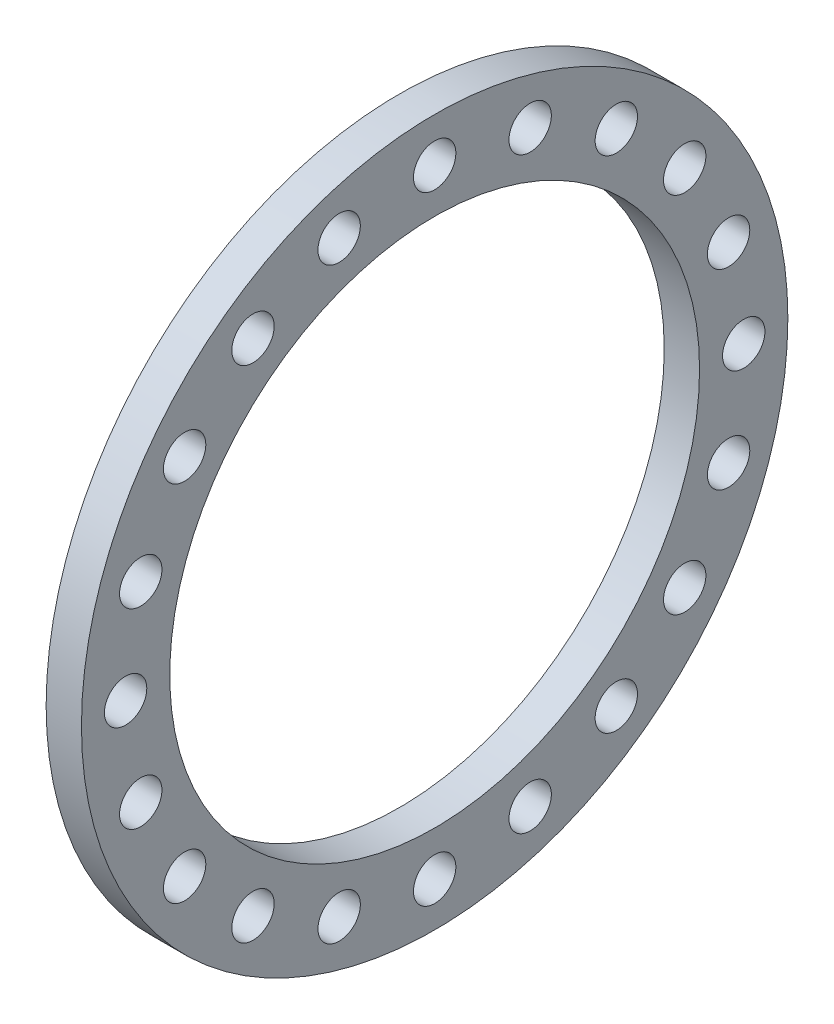
ISO-10303-21;
HEADER;
FILE_DESCRIPTION(('STEP AP214'),'2;1');
FILE_NAME('part.step','',(''),(''),'','','');
FILE_SCHEMA(('AUTOMOTIVE_DESIGN { 1 0 10303 214 1 1 1 1 }'));
ENDSEC;
DATA;
#1=APPLICATION_CONTEXT('core data for automotive mechanical design processes');
#2=APPLICATION_PROTOCOL_DEFINITION('international standard','automotive_design',2000,#1);
#3=PRODUCT_CONTEXT('',#1,'mechanical');
#4=PRODUCT('Part','Part','',(#3));
#5=PRODUCT_RELATED_PRODUCT_CATEGORY('part','',(#4));
#6=PRODUCT_DEFINITION_FORMATION('','',#4);
#7=PRODUCT_DEFINITION_CONTEXT('part definition',#1,'design');
#8=PRODUCT_DEFINITION('design','',#6,#7);
#9=PRODUCT_DEFINITION_SHAPE('','',#8);
#10=(LENGTH_UNIT() NAMED_UNIT(*) SI_UNIT(.MILLI.,.METRE.));
#11=(NAMED_UNIT(*) PLANE_ANGLE_UNIT() SI_UNIT($,.RADIAN.));
#12=(NAMED_UNIT(*) SI_UNIT($,.STERADIAN.) SOLID_ANGLE_UNIT());
#13=UNCERTAINTY_MEASURE_WITH_UNIT(LENGTH_MEASURE(1.E-05),#10,'distance_accuracy_value','');
#14=(GEOMETRIC_REPRESENTATION_CONTEXT(3) GLOBAL_UNCERTAINTY_ASSIGNED_CONTEXT((#13)) GLOBAL_UNIT_ASSIGNED_CONTEXT((#10,
#11,#12)) REPRESENTATION_CONTEXT('',''));
#15=CARTESIAN_POINT('',(0.,0.,0.));
#16=DIRECTION('',(0.,0.,1.));
#17=DIRECTION('',(1.,0.,0.));
#18=AXIS2_PLACEMENT_3D('',#15,#16,#17);
#19=CARTESIAN_POINT('',(5.,0.,0.));
#20=DIRECTION('',(1.,0.,0.));
#21=DIRECTION('',(0.,0.,-1.));
#22=AXIS2_PLACEMENT_3D('',#19,#20,#21);
#23=PLANE('',#22);
#24=CARTESIAN_POINT('',(5.,35.3944935039043,25.7156047877952));
#25=DIRECTION('',(1.,0.,0.));
#26=DIRECTION('',(0.,0.,-1.));
#27=AXIS2_PLACEMENT_3D('',#24,#25,#26);
#28=CIRCLE('',#27,2.99999999999999);
#29=CARTESIAN_POINT('',(5.,35.3944935039043,22.7156047877952));
#30=VERTEX_POINT('',#29);
#31=EDGE_CURVE('E163',#30,#30,#28,.T.);
#32=ORIENTED_EDGE('',*,*,#31,.F.);
#33=EDGE_LOOP('',(#32));
#34=FACE_BOUND('',#33,.T.);
#35=CARTESIAN_POINT('',(5.,13.5194935039044,41.6087225879128));
#36=DIRECTION('',(1.,0.,0.));
#37=DIRECTION('',(0.,0.,-1.));
#38=AXIS2_PLACEMENT_3D('',#35,#36,#37);
#39=CIRCLE('',#38,3.);
#40=CARTESIAN_POINT('',(5.,13.5194935039044,38.6087225879128));
#41=VERTEX_POINT('',#40);
#42=EDGE_CURVE('E151',#41,#41,#39,.T.);
#43=ORIENTED_EDGE('',*,*,#42,.F.);
#44=EDGE_LOOP('',(#43));
#45=FACE_BOUND('',#44,.T.);
#46=CARTESIAN_POINT('',(5.,-13.5194935039035,41.6087225879131));
#47=DIRECTION('',(1.,0.,0.));
#48=DIRECTION('',(0.,0.,-1.));
#49=AXIS2_PLACEMENT_3D('',#46,#47,#48);
#50=CIRCLE('',#49,3.);
#51=CARTESIAN_POINT('',(5.,-13.5194935039035,38.6087225879131));
#52=VERTEX_POINT('',#51);
#53=EDGE_CURVE('E139',#52,#52,#50,.T.);
#54=ORIENTED_EDGE('',*,*,#53,.F.);
#55=EDGE_LOOP('',(#54));
#56=FACE_BOUND('',#55,.T.);
#57=CARTESIAN_POINT('',(5.,-35.3944935039037,25.715604787796));
#58=DIRECTION('',(1.,0.,0.));
#59=DIRECTION('',(0.,0.,-1.));
#60=AXIS2_PLACEMENT_3D('',#57,#58,#59);
#61=CIRCLE('',#60,3.);
#62=CARTESIAN_POINT('',(5.,-35.3944935039037,22.715604787796));
#63=VERTEX_POINT('',#62);
#64=EDGE_CURVE('E127',#63,#63,#61,.T.);
#65=ORIENTED_EDGE('',*,*,#64,.F.);
#66=EDGE_LOOP('',(#65));
#67=FACE_BOUND('',#66,.T.);
#68=CARTESIAN_POINT('',(5.,-43.75,3.05504617148774E-13));
#69=DIRECTION('',(1.,0.,0.));
#70=DIRECTION('',(0.,0.,-1.));
#71=AXIS2_PLACEMENT_3D('',#68,#69,#70);
#72=CIRCLE('',#71,3.);
#73=CARTESIAN_POINT('',(5.,-43.75,-2.9999999999997));
#74=VERTEX_POINT('',#73);
#75=EDGE_CURVE('E115',#74,#74,#72,.T.);
#76=ORIENTED_EDGE('',*,*,#75,.F.);
#77=EDGE_LOOP('',(#76));
#78=FACE_BOUND('',#77,.T.);
#79=CARTESIAN_POINT('',(5.,-35.3944935039041,-25.7156047877955));
#80=DIRECTION('',(1.,0.,0.));
#81=DIRECTION('',(0.,0.,-1.));
#82=AXIS2_PLACEMENT_3D('',#79,#80,#81);
#83=CIRCLE('',#82,3.);
#84=CARTESIAN_POINT('',(5.,-35.3944935039041,-28.7156047877955));
#85=VERTEX_POINT('',#84);
#86=EDGE_CURVE('E103',#85,#85,#83,.T.);
#87=ORIENTED_EDGE('',*,*,#86,.F.);
#88=EDGE_LOOP('',(#87));
#89=FACE_BOUND('',#88,.T.);
#90=CARTESIAN_POINT('',(5.,-13.5194935039041,-41.6087225879129));
#91=DIRECTION('',(1.,0.,0.));
#92=DIRECTION('',(0.,0.,-1.));
#93=AXIS2_PLACEMENT_3D('',#90,#91,#92);
#94=CIRCLE('',#93,3.);
#95=CARTESIAN_POINT('',(5.,-13.5194935039041,-44.6087225879129));
#96=VERTEX_POINT('',#95);
#97=EDGE_CURVE('E91',#96,#96,#94,.T.);
#98=ORIENTED_EDGE('',*,*,#97,.F.);
#99=EDGE_LOOP('',(#98));
#100=FACE_BOUND('',#99,.T.);
#101=CARTESIAN_POINT('',(5.,13.5194935039038,-41.608722587913));
#102=DIRECTION('',(1.,0.,0.));
#103=DIRECTION('',(0.,0.,-1.));
#104=AXIS2_PLACEMENT_3D('',#101,#102,#103);
#105=CIRCLE('',#104,3.);
#106=CARTESIAN_POINT('',(5.,13.5194935039038,-44.608722587913));
#107=VERTEX_POINT('',#106);
#108=EDGE_CURVE('E79',#107,#107,#105,.T.);
#109=ORIENTED_EDGE('',*,*,#108,.F.);
#110=EDGE_LOOP('',(#109));
#111=FACE_BOUND('',#110,.T.);
#112=CARTESIAN_POINT('',(5.,35.3944935039039,-25.7156047877958));
#113=DIRECTION('',(1.,0.,0.));
#114=DIRECTION('',(0.,0.,-1.));
#115=AXIS2_PLACEMENT_3D('',#112,#113,#114);
#116=CIRCLE('',#115,3.);
#117=CARTESIAN_POINT('',(5.,35.3944935039039,-28.7156047877958));
#118=VERTEX_POINT('',#117);
#119=EDGE_CURVE('E67',#118,#118,#116,.T.);
#120=ORIENTED_EDGE('',*,*,#119,.F.);
#121=EDGE_LOOP('',(#120));
#122=FACE_BOUND('',#121,.T.);
#123=CARTESIAN_POINT('',(5.,43.75,0.));
#124=DIRECTION('',(1.,0.,0.));
#125=DIRECTION('',(0.,0.,-1.));
#126=AXIS2_PLACEMENT_3D('',#123,#124,#125);
#127=CIRCLE('',#126,3.);
#128=CARTESIAN_POINT('',(5.,43.75,-3.));
#129=VERTEX_POINT('',#128);
#130=EDGE_CURVE('E55',#129,#129,#127,.T.);
#131=ORIENTED_EDGE('',*,*,#130,.F.);
#132=EDGE_LOOP('',(#131));
#133=FACE_BOUND('',#132,.T.);
#134=CARTESIAN_POINT('',(5.,0.,0.));
#135=DIRECTION('',(1.,0.,0.));
#136=DIRECTION('',(0.,0.,-1.));
#137=AXIS2_PLACEMENT_3D('',#134,#135,#136);
#138=CIRCLE('',#137,50.);
#139=CARTESIAN_POINT('',(5.,0.,-50.));
#140=VERTEX_POINT('',#139);
#141=EDGE_CURVE('E10',#140,#140,#138,.T.);
#142=ORIENTED_EDGE('',*,*,#141,.T.);
#143=EDGE_LOOP('',(#142));
#144=FACE_BOUND('',#143,.T.);
#145=CARTESIAN_POINT('',(5.,0.,0.));
#146=DIRECTION('',(1.,0.,0.));
#147=DIRECTION('',(0.,0.,-1.));
#148=AXIS2_PLACEMENT_3D('',#145,#146,#147);
#149=CIRCLE('',#148,37.5);
#150=CARTESIAN_POINT('',(5.,0.,-37.5));
#151=VERTEX_POINT('',#150);
#152=EDGE_CURVE('E50',#151,#151,#149,.T.);
#153=ORIENTED_EDGE('',*,*,#152,.F.);
#154=EDGE_LOOP('',(#153));
#155=FACE_BOUND('',#154,.T.);
#156=CARTESIAN_POINT('',(5.,41.608722587913,-13.519493503904));
#157=DIRECTION('',(1.,0.,0.));
#158=DIRECTION('',(0.,0.,-1.));
#159=AXIS2_PLACEMENT_3D('',#156,#157,#158);
#160=CIRCLE('',#159,3.);
#161=CARTESIAN_POINT('',(5.,41.608722587913,-16.519493503904));
#162=VERTEX_POINT('',#161);
#163=EDGE_CURVE('E61',#162,#162,#160,.T.);
#164=ORIENTED_EDGE('',*,*,#163,.F.);
#165=EDGE_LOOP('',(#164));
#166=FACE_BOUND('',#165,.T.);
#167=CARTESIAN_POINT('',(5.,25.7156047877956,-35.394493503904));
#168=DIRECTION('',(1.,0.,0.));
#169=DIRECTION('',(0.,0.,-1.));
#170=AXIS2_PLACEMENT_3D('',#167,#168,#169);
#171=CIRCLE('',#170,3.);
#172=CARTESIAN_POINT('',(5.,25.7156047877956,-38.394493503904));
#173=VERTEX_POINT('',#172);
#174=EDGE_CURVE('E73',#173,#173,#171,.T.);
#175=ORIENTED_EDGE('',*,*,#174,.F.);
#176=EDGE_LOOP('',(#175));
#177=FACE_BOUND('',#176,.T.);
#178=CARTESIAN_POINT('',(5.,-1.52752308574387E-13,-43.75));
#179=DIRECTION('',(1.,0.,0.));
#180=DIRECTION('',(0.,0.,-1.));
#181=AXIS2_PLACEMENT_3D('',#178,#179,#180);
#182=CIRCLE('',#181,3.);
#183=CARTESIAN_POINT('',(5.,-1.52752308574387E-13,-46.75));
#184=VERTEX_POINT('',#183);
#185=EDGE_CURVE('E85',#184,#184,#182,.T.);
#186=ORIENTED_EDGE('',*,*,#185,.F.);
#187=EDGE_LOOP('',(#186));
#188=FACE_BOUND('',#187,.T.);
#189=CARTESIAN_POINT('',(5.,-25.7156047877959,-35.3944935039038));
#190=DIRECTION('',(1.,0.,0.));
#191=DIRECTION('',(0.,0.,-1.));
#192=AXIS2_PLACEMENT_3D('',#189,#190,#191);
#193=CIRCLE('',#192,3.);
#194=CARTESIAN_POINT('',(5.,-25.7156047877959,-38.3944935039038));
#195=VERTEX_POINT('',#194);
#196=EDGE_CURVE('E97',#195,#195,#193,.T.);
#197=ORIENTED_EDGE('',*,*,#196,.F.);
#198=EDGE_LOOP('',(#197));
#199=FACE_BOUND('',#198,.T.);
#200=CARTESIAN_POINT('',(5.,-41.6087225879131,-13.5194935039037));
#201=DIRECTION('',(1.,0.,0.));
#202=DIRECTION('',(0.,0.,-1.));
#203=AXIS2_PLACEMENT_3D('',#200,#201,#202);
#204=CIRCLE('',#203,3.);
#205=CARTESIAN_POINT('',(5.,-41.6087225879131,-16.5194935039037));
#206=VERTEX_POINT('',#205);
#207=EDGE_CURVE('E109',#206,#206,#204,.T.);
#208=ORIENTED_EDGE('',*,*,#207,.F.);
#209=EDGE_LOOP('',(#208));
#210=FACE_BOUND('',#209,.T.);
#211=CARTESIAN_POINT('',(5.,-41.6087225879129,13.5194935039043));
#212=DIRECTION('',(1.,0.,0.));
#213=DIRECTION('',(0.,0.,-1.));
#214=AXIS2_PLACEMENT_3D('',#211,#212,#213);
#215=CIRCLE('',#214,3.);
#216=CARTESIAN_POINT('',(5.,-41.6087225879129,10.5194935039043));
#217=VERTEX_POINT('',#216);
#218=EDGE_CURVE('E121',#217,#217,#215,.T.);
#219=ORIENTED_EDGE('',*,*,#218,.F.);
#220=EDGE_LOOP('',(#219));
#221=FACE_BOUND('',#220,.T.);
#222=CARTESIAN_POINT('',(5.,-25.7156047877954,35.3944935039042));
#223=DIRECTION('',(1.,0.,0.));
#224=DIRECTION('',(0.,0.,-1.));
#225=AXIS2_PLACEMENT_3D('',#222,#223,#224);
#226=CIRCLE('',#225,3.);
#227=CARTESIAN_POINT('',(5.,-25.7156047877954,32.3944935039042));
#228=VERTEX_POINT('',#227);
#229=EDGE_CURVE('E133',#228,#228,#226,.T.);
#230=ORIENTED_EDGE('',*,*,#229,.F.);
#231=EDGE_LOOP('',(#230));
#232=FACE_BOUND('',#231,.T.);
#233=CARTESIAN_POINT('',(5.,4.58256925723161E-13,43.75));
#234=DIRECTION('',(1.,0.,0.));
#235=DIRECTION('',(0.,0.,-1.));
#236=AXIS2_PLACEMENT_3D('',#233,#234,#235);
#237=CIRCLE('',#236,3.);
#238=CARTESIAN_POINT('',(5.,4.58256925723161E-13,40.75));
#239=VERTEX_POINT('',#238);
#240=EDGE_CURVE('E145',#239,#239,#237,.T.);
#241=ORIENTED_EDGE('',*,*,#240,.F.);
#242=EDGE_LOOP('',(#241));
#243=FACE_BOUND('',#242,.T.);
#244=CARTESIAN_POINT('',(5.,25.7156047877961,35.3944935039036));
#245=DIRECTION('',(1.,0.,0.));
#246=DIRECTION('',(0.,0.,-1.));
#247=AXIS2_PLACEMENT_3D('',#244,#245,#246);
#248=CIRCLE('',#247,3.);
#249=CARTESIAN_POINT('',(5.,25.7156047877961,32.3944935039036));
#250=VERTEX_POINT('',#249);
#251=EDGE_CURVE('E157',#250,#250,#248,.T.);
#252=ORIENTED_EDGE('',*,*,#251,.F.);
#253=EDGE_LOOP('',(#252));
#254=FACE_BOUND('',#253,.T.);
#255=CARTESIAN_POINT('',(5.,41.6087225879131,13.5194935039034));
#256=DIRECTION('',(1.,0.,0.));
#257=DIRECTION('',(0.,0.,-1.));
#258=AXIS2_PLACEMENT_3D('',#255,#256,#257);
#259=CIRCLE('',#258,3.);
#260=CARTESIAN_POINT('',(5.,41.6087225879131,10.5194935039034));
#261=VERTEX_POINT('',#260);
#262=EDGE_CURVE('E169',#261,#261,#259,.T.);
#263=ORIENTED_EDGE('',*,*,#262,.F.);
#264=EDGE_LOOP('',(#263));
#265=FACE_BOUND('',#264,.T.);
#266=ADVANCED_FACE('F39',(#34,#45,#56,#67,#78,#89,#100,#111,#122,#133,#144,#155,#166,#177,#188,
#199,#210,#221,#232,#243,#254,#265),#23,.T.);
#267=CARTESIAN_POINT('',(0.,0.,0.));
#268=DIRECTION('',(1.,0.,0.));
#269=DIRECTION('',(0.,0.,-1.));
#270=AXIS2_PLACEMENT_3D('',#267,#268,#269);
#271=PLANE('',#270);
#272=CARTESIAN_POINT('',(0.,0.,0.));
#273=DIRECTION('',(1.,0.,0.));
#274=DIRECTION('',(0.,0.,-1.));
#275=AXIS2_PLACEMENT_3D('',#272,#273,#274);
#276=CIRCLE('',#275,50.);
#277=CARTESIAN_POINT('',(0.,0.,-50.));
#278=VERTEX_POINT('',#277);
#279=EDGE_CURVE('E43',#278,#278,#276,.T.);
#280=ORIENTED_EDGE('',*,*,#279,.F.);
#281=EDGE_LOOP('',(#280));
#282=FACE_BOUND('',#281,.T.);
#283=CARTESIAN_POINT('',(0.,0.,0.));
#284=DIRECTION('',(1.,0.,0.));
#285=DIRECTION('',(0.,0.,-1.));
#286=AXIS2_PLACEMENT_3D('',#283,#284,#285);
#287=CIRCLE('',#286,37.5);
#288=CARTESIAN_POINT('',(0.,0.,-37.5));
#289=VERTEX_POINT('',#288);
#290=EDGE_CURVE('E52',#289,#289,#287,.T.);
#291=ORIENTED_EDGE('',*,*,#290,.T.);
#292=EDGE_LOOP('',(#291));
#293=FACE_BOUND('',#292,.T.);
#294=CARTESIAN_POINT('',(0.,43.75,0.));
#295=DIRECTION('',(1.,0.,0.));
#296=DIRECTION('',(0.,0.,-1.));
#297=AXIS2_PLACEMENT_3D('',#294,#295,#296);
#298=CIRCLE('',#297,3.);
#299=CARTESIAN_POINT('',(0.,43.75,-3.));
#300=VERTEX_POINT('',#299);
#301=EDGE_CURVE('E58',#300,#300,#298,.T.);
#302=ORIENTED_EDGE('',*,*,#301,.T.);
#303=EDGE_LOOP('',(#302));
#304=FACE_BOUND('',#303,.T.);
#305=CARTESIAN_POINT('',(0.,41.608722587913,-13.519493503904));
#306=DIRECTION('',(1.,0.,0.));
#307=DIRECTION('',(0.,0.,-1.));
#308=AXIS2_PLACEMENT_3D('',#305,#306,#307);
#309=CIRCLE('',#308,3.);
#310=CARTESIAN_POINT('',(0.,41.608722587913,-16.519493503904));
#311=VERTEX_POINT('',#310);
#312=EDGE_CURVE('E64',#311,#311,#309,.T.);
#313=ORIENTED_EDGE('',*,*,#312,.T.);
#314=EDGE_LOOP('',(#313));
#315=FACE_BOUND('',#314,.T.);
#316=CARTESIAN_POINT('',(0.,35.3944935039039,-25.7156047877958));
#317=DIRECTION('',(1.,0.,0.));
#318=DIRECTION('',(0.,0.,-1.));
#319=AXIS2_PLACEMENT_3D('',#316,#317,#318);
#320=CIRCLE('',#319,3.);
#321=CARTESIAN_POINT('',(0.,35.3944935039039,-28.7156047877958));
#322=VERTEX_POINT('',#321);
#323=EDGE_CURVE('E70',#322,#322,#320,.T.);
#324=ORIENTED_EDGE('',*,*,#323,.T.);
#325=EDGE_LOOP('',(#324));
#326=FACE_BOUND('',#325,.T.);
#327=CARTESIAN_POINT('',(0.,25.7156047877956,-35.394493503904));
#328=DIRECTION('',(1.,0.,0.));
#329=DIRECTION('',(0.,0.,-1.));
#330=AXIS2_PLACEMENT_3D('',#327,#328,#329);
#331=CIRCLE('',#330,3.);
#332=CARTESIAN_POINT('',(0.,25.7156047877956,-38.394493503904));
#333=VERTEX_POINT('',#332);
#334=EDGE_CURVE('E76',#333,#333,#331,.T.);
#335=ORIENTED_EDGE('',*,*,#334,.T.);
#336=EDGE_LOOP('',(#335));
#337=FACE_BOUND('',#336,.T.);
#338=CARTESIAN_POINT('',(0.,13.5194935039038,-41.608722587913));
#339=DIRECTION('',(1.,0.,0.));
#340=DIRECTION('',(0.,0.,-1.));
#341=AXIS2_PLACEMENT_3D('',#338,#339,#340);
#342=CIRCLE('',#341,3.);
#343=CARTESIAN_POINT('',(0.,13.5194935039038,-44.608722587913));
#344=VERTEX_POINT('',#343);
#345=EDGE_CURVE('E82',#344,#344,#342,.T.);
#346=ORIENTED_EDGE('',*,*,#345,.T.);
#347=EDGE_LOOP('',(#346));
#348=FACE_BOUND('',#347,.T.);
#349=CARTESIAN_POINT('',(0.,-1.52752308574387E-13,-43.75));
#350=DIRECTION('',(1.,0.,0.));
#351=DIRECTION('',(0.,0.,-1.));
#352=AXIS2_PLACEMENT_3D('',#349,#350,#351);
#353=CIRCLE('',#352,3.);
#354=CARTESIAN_POINT('',(0.,-1.52752308574387E-13,-46.75));
#355=VERTEX_POINT('',#354);
#356=EDGE_CURVE('E88',#355,#355,#353,.T.);
#357=ORIENTED_EDGE('',*,*,#356,.T.);
#358=EDGE_LOOP('',(#357));
#359=FACE_BOUND('',#358,.T.);
#360=CARTESIAN_POINT('',(0.,-13.5194935039041,-41.6087225879129));
#361=DIRECTION('',(1.,0.,0.));
#362=DIRECTION('',(0.,0.,-1.));
#363=AXIS2_PLACEMENT_3D('',#360,#361,#362);
#364=CIRCLE('',#363,3.);
#365=CARTESIAN_POINT('',(0.,-13.5194935039041,-44.6087225879129));
#366=VERTEX_POINT('',#365);
#367=EDGE_CURVE('E94',#366,#366,#364,.T.);
#368=ORIENTED_EDGE('',*,*,#367,.T.);
#369=EDGE_LOOP('',(#368));
#370=FACE_BOUND('',#369,.T.);
#371=CARTESIAN_POINT('',(0.,-25.7156047877959,-35.3944935039038));
#372=DIRECTION('',(1.,0.,0.));
#373=DIRECTION('',(0.,0.,-1.));
#374=AXIS2_PLACEMENT_3D('',#371,#372,#373);
#375=CIRCLE('',#374,3.);
#376=CARTESIAN_POINT('',(0.,-25.7156047877959,-38.3944935039038));
#377=VERTEX_POINT('',#376);
#378=EDGE_CURVE('E100',#377,#377,#375,.T.);
#379=ORIENTED_EDGE('',*,*,#378,.T.);
#380=EDGE_LOOP('',(#379));
#381=FACE_BOUND('',#380,.T.);
#382=CARTESIAN_POINT('',(0.,-35.3944935039041,-25.7156047877955));
#383=DIRECTION('',(1.,0.,0.));
#384=DIRECTION('',(0.,0.,-1.));
#385=AXIS2_PLACEMENT_3D('',#382,#383,#384);
#386=CIRCLE('',#385,3.);
#387=CARTESIAN_POINT('',(0.,-35.3944935039041,-28.7156047877955));
#388=VERTEX_POINT('',#387);
#389=EDGE_CURVE('E106',#388,#388,#386,.T.);
#390=ORIENTED_EDGE('',*,*,#389,.T.);
#391=EDGE_LOOP('',(#390));
#392=FACE_BOUND('',#391,.T.);
#393=CARTESIAN_POINT('',(0.,-41.6087225879131,-13.5194935039037));
#394=DIRECTION('',(1.,0.,0.));
#395=DIRECTION('',(0.,0.,-1.));
#396=AXIS2_PLACEMENT_3D('',#393,#394,#395);
#397=CIRCLE('',#396,3.);
#398=CARTESIAN_POINT('',(0.,-41.6087225879131,-16.5194935039037));
#399=VERTEX_POINT('',#398);
#400=EDGE_CURVE('E112',#399,#399,#397,.T.);
#401=ORIENTED_EDGE('',*,*,#400,.T.);
#402=EDGE_LOOP('',(#401));
#403=FACE_BOUND('',#402,.T.);
#404=CARTESIAN_POINT('',(0.,-43.75,3.05504617148774E-13));
#405=DIRECTION('',(1.,0.,0.));
#406=DIRECTION('',(0.,0.,-1.));
#407=AXIS2_PLACEMENT_3D('',#404,#405,#406);
#408=CIRCLE('',#407,3.);
#409=CARTESIAN_POINT('',(0.,-43.75,-2.9999999999997));
#410=VERTEX_POINT('',#409);
#411=EDGE_CURVE('E118',#410,#410,#408,.T.);
#412=ORIENTED_EDGE('',*,*,#411,.T.);
#413=EDGE_LOOP('',(#412));
#414=FACE_BOUND('',#413,.T.);
#415=CARTESIAN_POINT('',(0.,-41.6087225879129,13.5194935039043));
#416=DIRECTION('',(1.,0.,0.));
#417=DIRECTION('',(0.,0.,-1.));
#418=AXIS2_PLACEMENT_3D('',#415,#416,#417);
#419=CIRCLE('',#418,3.);
#420=CARTESIAN_POINT('',(0.,-41.6087225879129,10.5194935039043));
#421=VERTEX_POINT('',#420);
#422=EDGE_CURVE('E124',#421,#421,#419,.T.);
#423=ORIENTED_EDGE('',*,*,#422,.T.);
#424=EDGE_LOOP('',(#423));
#425=FACE_BOUND('',#424,.T.);
#426=CARTESIAN_POINT('',(0.,-35.3944935039037,25.715604787796));
#427=DIRECTION('',(1.,0.,0.));
#428=DIRECTION('',(0.,0.,-1.));
#429=AXIS2_PLACEMENT_3D('',#426,#427,#428);
#430=CIRCLE('',#429,3.);
#431=CARTESIAN_POINT('',(0.,-35.3944935039037,22.715604787796));
#432=VERTEX_POINT('',#431);
#433=EDGE_CURVE('E130',#432,#432,#430,.T.);
#434=ORIENTED_EDGE('',*,*,#433,.T.);
#435=EDGE_LOOP('',(#434));
#436=FACE_BOUND('',#435,.T.);
#437=CARTESIAN_POINT('',(0.,-25.7156047877954,35.3944935039042));
#438=DIRECTION('',(1.,0.,0.));
#439=DIRECTION('',(0.,0.,-1.));
#440=AXIS2_PLACEMENT_3D('',#437,#438,#439);
#441=CIRCLE('',#440,3.);
#442=CARTESIAN_POINT('',(0.,-25.7156047877954,32.3944935039042));
#443=VERTEX_POINT('',#442);
#444=EDGE_CURVE('E136',#443,#443,#441,.T.);
#445=ORIENTED_EDGE('',*,*,#444,.T.);
#446=EDGE_LOOP('',(#445));
#447=FACE_BOUND('',#446,.T.);
#448=CARTESIAN_POINT('',(0.,-13.5194935039035,41.6087225879131));
#449=DIRECTION('',(1.,0.,0.));
#450=DIRECTION('',(0.,0.,-1.));
#451=AXIS2_PLACEMENT_3D('',#448,#449,#450);
#452=CIRCLE('',#451,3.);
#453=CARTESIAN_POINT('',(0.,-13.5194935039035,38.6087225879131));
#454=VERTEX_POINT('',#453);
#455=EDGE_CURVE('E142',#454,#454,#452,.T.);
#456=ORIENTED_EDGE('',*,*,#455,.T.);
#457=EDGE_LOOP('',(#456));
#458=FACE_BOUND('',#457,.T.);
#459=CARTESIAN_POINT('',(0.,4.58256925723161E-13,43.75));
#460=DIRECTION('',(1.,0.,0.));
#461=DIRECTION('',(0.,0.,-1.));
#462=AXIS2_PLACEMENT_3D('',#459,#460,#461);
#463=CIRCLE('',#462,3.);
#464=CARTESIAN_POINT('',(0.,4.58256925723161E-13,40.75));
#465=VERTEX_POINT('',#464);
#466=EDGE_CURVE('E148',#465,#465,#463,.T.);
#467=ORIENTED_EDGE('',*,*,#466,.T.);
#468=EDGE_LOOP('',(#467));
#469=FACE_BOUND('',#468,.T.);
#470=CARTESIAN_POINT('',(0.,13.5194935039044,41.6087225879128));
#471=DIRECTION('',(1.,0.,0.));
#472=DIRECTION('',(0.,0.,-1.));
#473=AXIS2_PLACEMENT_3D('',#470,#471,#472);
#474=CIRCLE('',#473,3.);
#475=CARTESIAN_POINT('',(0.,13.5194935039044,38.6087225879128));
#476=VERTEX_POINT('',#475);
#477=EDGE_CURVE('E154',#476,#476,#474,.T.);
#478=ORIENTED_EDGE('',*,*,#477,.T.);
#479=EDGE_LOOP('',(#478));
#480=FACE_BOUND('',#479,.T.);
#481=CARTESIAN_POINT('',(0.,25.7156047877961,35.3944935039036));
#482=DIRECTION('',(1.,0.,0.));
#483=DIRECTION('',(0.,0.,-1.));
#484=AXIS2_PLACEMENT_3D('',#481,#482,#483);
#485=CIRCLE('',#484,3.);
#486=CARTESIAN_POINT('',(0.,25.7156047877961,32.3944935039036));
#487=VERTEX_POINT('',#486);
#488=EDGE_CURVE('E160',#487,#487,#485,.T.);
#489=ORIENTED_EDGE('',*,*,#488,.T.);
#490=EDGE_LOOP('',(#489));
#491=FACE_BOUND('',#490,.T.);
#492=CARTESIAN_POINT('',(0.,35.3944935039043,25.7156047877952));
#493=DIRECTION('',(1.,0.,0.));
#494=DIRECTION('',(0.,0.,-1.));
#495=AXIS2_PLACEMENT_3D('',#492,#493,#494);
#496=CIRCLE('',#495,2.99999999999999);
#497=CARTESIAN_POINT('',(0.,35.3944935039043,22.7156047877952));
#498=VERTEX_POINT('',#497);
#499=EDGE_CURVE('E166',#498,#498,#496,.T.);
#500=ORIENTED_EDGE('',*,*,#499,.T.);
#501=EDGE_LOOP('',(#500));
#502=FACE_BOUND('',#501,.T.);
#503=CARTESIAN_POINT('',(0.,41.6087225879131,13.5194935039034));
#504=DIRECTION('',(1.,0.,0.));
#505=DIRECTION('',(0.,0.,-1.));
#506=AXIS2_PLACEMENT_3D('',#503,#504,#505);
#507=CIRCLE('',#506,3.);
#508=CARTESIAN_POINT('',(0.,41.6087225879131,10.5194935039034));
#509=VERTEX_POINT('',#508);
#510=EDGE_CURVE('E172',#509,#509,#507,.T.);
#511=ORIENTED_EDGE('',*,*,#510,.T.);
#512=EDGE_LOOP('',(#511));
#513=FACE_BOUND('',#512,.T.);
#514=ADVANCED_FACE('F182',(#282,#293,#304,#315,#326,#337,#348,#359,#370,#381,#392,#403,#414,
#425,#436,#447,#458,#469,#480,#491,#502,#513),#271,.F.);
#515=CARTESIAN_POINT('',(5.,0.,0.));
#516=DIRECTION('',(-1.,0.,0.));
#517=DIRECTION('',(0.,0.,1.));
#518=AXIS2_PLACEMENT_3D('',#515,#516,#517);
#519=CYLINDRICAL_SURFACE('',#518,50.);
#520=ORIENTED_EDGE('',*,*,#141,.F.);
#521=EDGE_LOOP('',(#520));
#522=FACE_BOUND('',#521,.T.);
#523=ORIENTED_EDGE('',*,*,#279,.T.);
#524=EDGE_LOOP('',(#523));
#525=FACE_BOUND('',#524,.T.);
#526=ADVANCED_FACE('F41',(#522,#525),#519,.T.);
#527=CARTESIAN_POINT('',(5.,0.,0.));
#528=DIRECTION('',(-1.,0.,0.));
#529=DIRECTION('',(0.,0.,1.));
#530=AXIS2_PLACEMENT_3D('',#527,#528,#529);
#531=CYLINDRICAL_SURFACE('',#530,37.5);
#532=ORIENTED_EDGE('',*,*,#152,.T.);
#533=EDGE_LOOP('',(#532));
#534=FACE_BOUND('',#533,.T.);
#535=ORIENTED_EDGE('',*,*,#290,.F.);
#536=EDGE_LOOP('',(#535));
#537=FACE_BOUND('',#536,.T.);
#538=ADVANCED_FACE('F192',(#534,#537),#531,.F.);
#539=CARTESIAN_POINT('',(5.,43.75,0.));
#540=DIRECTION('',(-1.,0.,0.));
#541=DIRECTION('',(0.,0.,1.));
#542=AXIS2_PLACEMENT_3D('',#539,#540,#541);
#543=CYLINDRICAL_SURFACE('',#542,3.);
#544=ORIENTED_EDGE('',*,*,#130,.T.);
#545=EDGE_LOOP('',(#544));
#546=FACE_BOUND('',#545,.T.);
#547=ORIENTED_EDGE('',*,*,#301,.F.);
#548=EDGE_LOOP('',(#547));
#549=FACE_BOUND('',#548,.T.);
#550=ADVANCED_FACE('F195',(#546,#549),#543,.F.);
#551=CARTESIAN_POINT('',(5.,41.608722587913,-13.519493503904));
#552=DIRECTION('',(-1.,0.,0.));
#553=DIRECTION('',(0.,0.,1.));
#554=AXIS2_PLACEMENT_3D('',#551,#552,#553);
#555=CYLINDRICAL_SURFACE('',#554,3.);
#556=ORIENTED_EDGE('',*,*,#163,.T.);
#557=EDGE_LOOP('',(#556));
#558=FACE_BOUND('',#557,.T.);
#559=ORIENTED_EDGE('',*,*,#312,.F.);
#560=EDGE_LOOP('',(#559));
#561=FACE_BOUND('',#560,.T.);
#562=ADVANCED_FACE('F199',(#558,#561),#555,.F.);
#563=CARTESIAN_POINT('',(5.,35.3944935039039,-25.7156047877958));
#564=DIRECTION('',(-1.,0.,0.));
#565=DIRECTION('',(0.,0.,1.));
#566=AXIS2_PLACEMENT_3D('',#563,#564,#565);
#567=CYLINDRICAL_SURFACE('',#566,3.);
#568=ORIENTED_EDGE('',*,*,#119,.T.);
#569=EDGE_LOOP('',(#568));
#570=FACE_BOUND('',#569,.T.);
#571=ORIENTED_EDGE('',*,*,#323,.F.);
#572=EDGE_LOOP('',(#571));
#573=FACE_BOUND('',#572,.T.);
#574=ADVANCED_FACE('F203',(#570,#573),#567,.F.);
#575=CARTESIAN_POINT('',(5.,25.7156047877956,-35.394493503904));
#576=DIRECTION('',(-1.,0.,0.));
#577=DIRECTION('',(0.,0.,1.));
#578=AXIS2_PLACEMENT_3D('',#575,#576,#577);
#579=CYLINDRICAL_SURFACE('',#578,3.);
#580=ORIENTED_EDGE('',*,*,#174,.T.);
#581=EDGE_LOOP('',(#580));
#582=FACE_BOUND('',#581,.T.);
#583=ORIENTED_EDGE('',*,*,#334,.F.);
#584=EDGE_LOOP('',(#583));
#585=FACE_BOUND('',#584,.T.);
#586=ADVANCED_FACE('F207',(#582,#585),#579,.F.);
#587=CARTESIAN_POINT('',(5.,13.5194935039038,-41.608722587913));
#588=DIRECTION('',(-1.,0.,0.));
#589=DIRECTION('',(0.,0.,1.));
#590=AXIS2_PLACEMENT_3D('',#587,#588,#589);
#591=CYLINDRICAL_SURFACE('',#590,3.);
#592=ORIENTED_EDGE('',*,*,#108,.T.);
#593=EDGE_LOOP('',(#592));
#594=FACE_BOUND('',#593,.T.);
#595=ORIENTED_EDGE('',*,*,#345,.F.);
#596=EDGE_LOOP('',(#595));
#597=FACE_BOUND('',#596,.T.);
#598=ADVANCED_FACE('F211',(#594,#597),#591,.F.);
#599=CARTESIAN_POINT('',(5.,-1.52752308574387E-13,-43.75));
#600=DIRECTION('',(-1.,0.,0.));
#601=DIRECTION('',(0.,0.,1.));
#602=AXIS2_PLACEMENT_3D('',#599,#600,#601);
#603=CYLINDRICAL_SURFACE('',#602,3.);
#604=ORIENTED_EDGE('',*,*,#185,.T.);
#605=EDGE_LOOP('',(#604));
#606=FACE_BOUND('',#605,.T.);
#607=ORIENTED_EDGE('',*,*,#356,.F.);
#608=EDGE_LOOP('',(#607));
#609=FACE_BOUND('',#608,.T.);
#610=ADVANCED_FACE('F215',(#606,#609),#603,.F.);
#611=CARTESIAN_POINT('',(5.,-13.5194935039041,-41.6087225879129));
#612=DIRECTION('',(-1.,0.,0.));
#613=DIRECTION('',(0.,0.,1.));
#614=AXIS2_PLACEMENT_3D('',#611,#612,#613);
#615=CYLINDRICAL_SURFACE('',#614,3.);
#616=ORIENTED_EDGE('',*,*,#97,.T.);
#617=EDGE_LOOP('',(#616));
#618=FACE_BOUND('',#617,.T.);
#619=ORIENTED_EDGE('',*,*,#367,.F.);
#620=EDGE_LOOP('',(#619));
#621=FACE_BOUND('',#620,.T.);
#622=ADVANCED_FACE('F219',(#618,#621),#615,.F.);
#623=CARTESIAN_POINT('',(5.,-25.7156047877959,-35.3944935039038));
#624=DIRECTION('',(-1.,0.,0.));
#625=DIRECTION('',(0.,0.,1.));
#626=AXIS2_PLACEMENT_3D('',#623,#624,#625);
#627=CYLINDRICAL_SURFACE('',#626,3.);
#628=ORIENTED_EDGE('',*,*,#196,.T.);
#629=EDGE_LOOP('',(#628));
#630=FACE_BOUND('',#629,.T.);
#631=ORIENTED_EDGE('',*,*,#378,.F.);
#632=EDGE_LOOP('',(#631));
#633=FACE_BOUND('',#632,.T.);
#634=ADVANCED_FACE('F223',(#630,#633),#627,.F.);
#635=CARTESIAN_POINT('',(5.,-35.3944935039041,-25.7156047877955));
#636=DIRECTION('',(-1.,0.,0.));
#637=DIRECTION('',(0.,0.,1.));
#638=AXIS2_PLACEMENT_3D('',#635,#636,#637);
#639=CYLINDRICAL_SURFACE('',#638,3.);
#640=ORIENTED_EDGE('',*,*,#86,.T.);
#641=EDGE_LOOP('',(#640));
#642=FACE_BOUND('',#641,.T.);
#643=ORIENTED_EDGE('',*,*,#389,.F.);
#644=EDGE_LOOP('',(#643));
#645=FACE_BOUND('',#644,.T.);
#646=ADVANCED_FACE('F227',(#642,#645),#639,.F.);
#647=CARTESIAN_POINT('',(5.,-41.6087225879131,-13.5194935039037));
#648=DIRECTION('',(-1.,0.,0.));
#649=DIRECTION('',(0.,0.,1.));
#650=AXIS2_PLACEMENT_3D('',#647,#648,#649);
#651=CYLINDRICAL_SURFACE('',#650,3.);
#652=ORIENTED_EDGE('',*,*,#207,.T.);
#653=EDGE_LOOP('',(#652));
#654=FACE_BOUND('',#653,.T.);
#655=ORIENTED_EDGE('',*,*,#400,.F.);
#656=EDGE_LOOP('',(#655));
#657=FACE_BOUND('',#656,.T.);
#658=ADVANCED_FACE('F231',(#654,#657),#651,.F.);
#659=CARTESIAN_POINT('',(5.,-43.75,3.05504617148774E-13));
#660=DIRECTION('',(-1.,0.,0.));
#661=DIRECTION('',(0.,0.,1.));
#662=AXIS2_PLACEMENT_3D('',#659,#660,#661);
#663=CYLINDRICAL_SURFACE('',#662,3.);
#664=ORIENTED_EDGE('',*,*,#75,.T.);
#665=EDGE_LOOP('',(#664));
#666=FACE_BOUND('',#665,.T.);
#667=ORIENTED_EDGE('',*,*,#411,.F.);
#668=EDGE_LOOP('',(#667));
#669=FACE_BOUND('',#668,.T.);
#670=ADVANCED_FACE('F235',(#666,#669),#663,.F.);
#671=CARTESIAN_POINT('',(5.,-41.6087225879129,13.5194935039043));
#672=DIRECTION('',(-1.,0.,0.));
#673=DIRECTION('',(0.,0.,1.));
#674=AXIS2_PLACEMENT_3D('',#671,#672,#673);
#675=CYLINDRICAL_SURFACE('',#674,3.);
#676=ORIENTED_EDGE('',*,*,#218,.T.);
#677=EDGE_LOOP('',(#676));
#678=FACE_BOUND('',#677,.T.);
#679=ORIENTED_EDGE('',*,*,#422,.F.);
#680=EDGE_LOOP('',(#679));
#681=FACE_BOUND('',#680,.T.);
#682=ADVANCED_FACE('F239',(#678,#681),#675,.F.);
#683=CARTESIAN_POINT('',(5.,-35.3944935039037,25.715604787796));
#684=DIRECTION('',(-1.,0.,0.));
#685=DIRECTION('',(0.,0.,1.));
#686=AXIS2_PLACEMENT_3D('',#683,#684,#685);
#687=CYLINDRICAL_SURFACE('',#686,3.);
#688=ORIENTED_EDGE('',*,*,#64,.T.);
#689=EDGE_LOOP('',(#688));
#690=FACE_BOUND('',#689,.T.);
#691=ORIENTED_EDGE('',*,*,#433,.F.);
#692=EDGE_LOOP('',(#691));
#693=FACE_BOUND('',#692,.T.);
#694=ADVANCED_FACE('F243',(#690,#693),#687,.F.);
#695=CARTESIAN_POINT('',(5.,-25.7156047877954,35.3944935039042));
#696=DIRECTION('',(-1.,0.,0.));
#697=DIRECTION('',(0.,0.,1.));
#698=AXIS2_PLACEMENT_3D('',#695,#696,#697);
#699=CYLINDRICAL_SURFACE('',#698,3.);
#700=ORIENTED_EDGE('',*,*,#229,.T.);
#701=EDGE_LOOP('',(#700));
#702=FACE_BOUND('',#701,.T.);
#703=ORIENTED_EDGE('',*,*,#444,.F.);
#704=EDGE_LOOP('',(#703));
#705=FACE_BOUND('',#704,.T.);
#706=ADVANCED_FACE('F247',(#702,#705),#699,.F.);
#707=CARTESIAN_POINT('',(5.,-13.5194935039035,41.6087225879131));
#708=DIRECTION('',(-1.,0.,0.));
#709=DIRECTION('',(0.,0.,1.));
#710=AXIS2_PLACEMENT_3D('',#707,#708,#709);
#711=CYLINDRICAL_SURFACE('',#710,3.);
#712=ORIENTED_EDGE('',*,*,#53,.T.);
#713=EDGE_LOOP('',(#712));
#714=FACE_BOUND('',#713,.T.);
#715=ORIENTED_EDGE('',*,*,#455,.F.);
#716=EDGE_LOOP('',(#715));
#717=FACE_BOUND('',#716,.T.);
#718=ADVANCED_FACE('F251',(#714,#717),#711,.F.);
#719=CARTESIAN_POINT('',(5.,4.58256925723161E-13,43.75));
#720=DIRECTION('',(-1.,0.,0.));
#721=DIRECTION('',(0.,0.,1.));
#722=AXIS2_PLACEMENT_3D('',#719,#720,#721);
#723=CYLINDRICAL_SURFACE('',#722,3.);
#724=ORIENTED_EDGE('',*,*,#240,.T.);
#725=EDGE_LOOP('',(#724));
#726=FACE_BOUND('',#725,.T.);
#727=ORIENTED_EDGE('',*,*,#466,.F.);
#728=EDGE_LOOP('',(#727));
#729=FACE_BOUND('',#728,.T.);
#730=ADVANCED_FACE('F255',(#726,#729),#723,.F.);
#731=CARTESIAN_POINT('',(5.,13.5194935039044,41.6087225879128));
#732=DIRECTION('',(-1.,0.,0.));
#733=DIRECTION('',(0.,0.,1.));
#734=AXIS2_PLACEMENT_3D('',#731,#732,#733);
#735=CYLINDRICAL_SURFACE('',#734,3.);
#736=ORIENTED_EDGE('',*,*,#42,.T.);
#737=EDGE_LOOP('',(#736));
#738=FACE_BOUND('',#737,.T.);
#739=ORIENTED_EDGE('',*,*,#477,.F.);
#740=EDGE_LOOP('',(#739));
#741=FACE_BOUND('',#740,.T.);
#742=ADVANCED_FACE('F259',(#738,#741),#735,.F.);
#743=CARTESIAN_POINT('',(5.,25.7156047877961,35.3944935039036));
#744=DIRECTION('',(-1.,0.,0.));
#745=DIRECTION('',(0.,0.,1.));
#746=AXIS2_PLACEMENT_3D('',#743,#744,#745);
#747=CYLINDRICAL_SURFACE('',#746,3.);
#748=ORIENTED_EDGE('',*,*,#251,.T.);
#749=EDGE_LOOP('',(#748));
#750=FACE_BOUND('',#749,.T.);
#751=ORIENTED_EDGE('',*,*,#488,.F.);
#752=EDGE_LOOP('',(#751));
#753=FACE_BOUND('',#752,.T.);
#754=ADVANCED_FACE('F263',(#750,#753),#747,.F.);
#755=CARTESIAN_POINT('',(5.,35.3944935039043,25.7156047877952));
#756=DIRECTION('',(-1.,0.,0.));
#757=DIRECTION('',(0.,0.,1.));
#758=AXIS2_PLACEMENT_3D('',#755,#756,#757);
#759=CYLINDRICAL_SURFACE('',#758,2.99999999999999);
#760=ORIENTED_EDGE('',*,*,#31,.T.);
#761=EDGE_LOOP('',(#760));
#762=FACE_BOUND('',#761,.T.);
#763=ORIENTED_EDGE('',*,*,#499,.F.);
#764=EDGE_LOOP('',(#763));
#765=FACE_BOUND('',#764,.T.);
#766=ADVANCED_FACE('F267',(#762,#765),#759,.F.);
#767=CARTESIAN_POINT('',(5.,41.6087225879131,13.5194935039034));
#768=DIRECTION('',(-1.,0.,0.));
#769=DIRECTION('',(0.,0.,1.));
#770=AXIS2_PLACEMENT_3D('',#767,#768,#769);
#771=CYLINDRICAL_SURFACE('',#770,3.);
#772=ORIENTED_EDGE('',*,*,#262,.T.);
#773=EDGE_LOOP('',(#772));
#774=FACE_BOUND('',#773,.T.);
#775=ORIENTED_EDGE('',*,*,#510,.F.);
#776=EDGE_LOOP('',(#775));
#777=FACE_BOUND('',#776,.T.);
#778=ADVANCED_FACE('F178',(#774,#777),#771,.F.);
#779=CLOSED_SHELL('',(#266,#514,#526,#538,#550,#562,#574,#586,#598,#610,#622,#634,#646,#658,
#670,#682,#694,#706,#718,#730,#742,#754,#766,#778));
#780=MANIFOLD_SOLID_BREP('B2',#779);
#781=ADVANCED_BREP_SHAPE_REPRESENTATION('',(#18,#780),#14);
#782=SHAPE_DEFINITION_REPRESENTATION(#9,#781);
ENDSEC;
END-ISO-10303-21;
